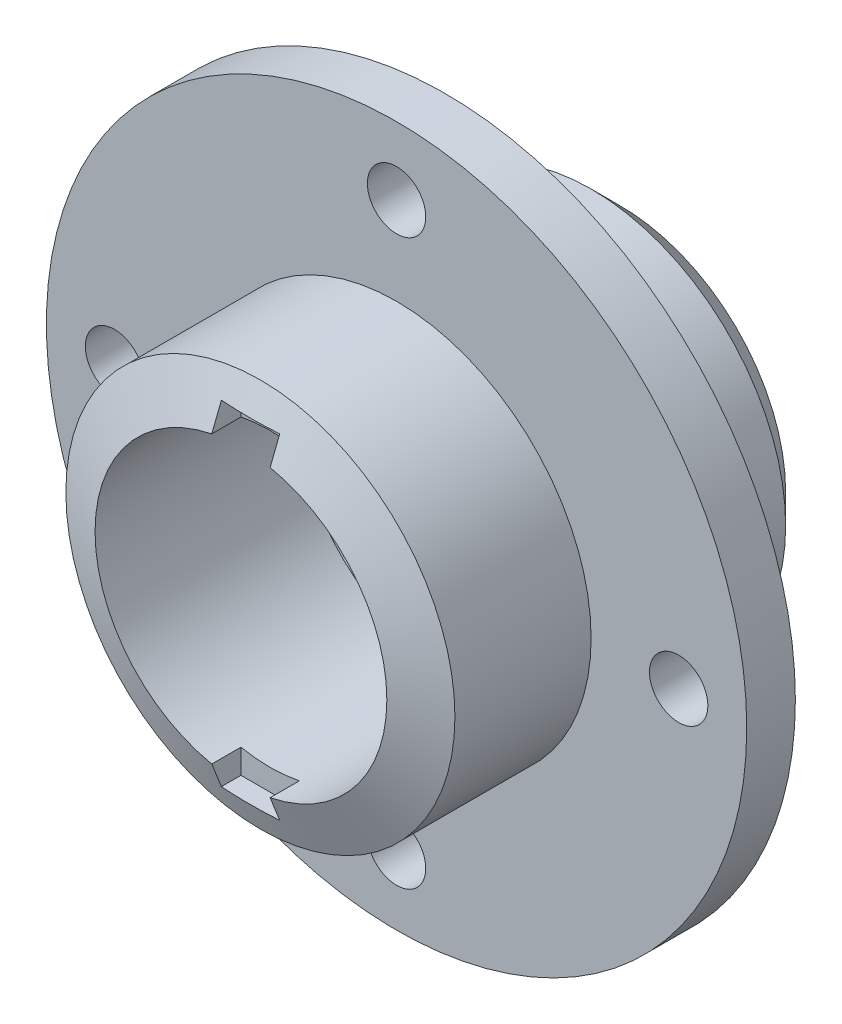
ISO-10303-21;
HEADER;
FILE_DESCRIPTION(('STEP AP214'),'2;1');
FILE_NAME('part.step','',(''),(''),'','','');
FILE_SCHEMA(('AUTOMOTIVE_DESIGN { 1 0 10303 214 1 1 1 1 }'));
ENDSEC;
DATA;
#1=APPLICATION_CONTEXT('core data for automotive mechanical design processes');
#2=APPLICATION_PROTOCOL_DEFINITION('international standard','automotive_design',2000,#1);
#3=PRODUCT_CONTEXT('',#1,'mechanical');
#4=PRODUCT('Part','Part','',(#3));
#5=PRODUCT_RELATED_PRODUCT_CATEGORY('part','',(#4));
#6=PRODUCT_DEFINITION_FORMATION('','',#4);
#7=PRODUCT_DEFINITION_CONTEXT('part definition',#1,'design');
#8=PRODUCT_DEFINITION('design','',#6,#7);
#9=PRODUCT_DEFINITION_SHAPE('','',#8);
#10=(LENGTH_UNIT() NAMED_UNIT(*) SI_UNIT(.MILLI.,.METRE.));
#11=(NAMED_UNIT(*) PLANE_ANGLE_UNIT() SI_UNIT($,.RADIAN.));
#12=(NAMED_UNIT(*) SI_UNIT($,.STERADIAN.) SOLID_ANGLE_UNIT());
#13=UNCERTAINTY_MEASURE_WITH_UNIT(LENGTH_MEASURE(1.E-05),#10,'distance_accuracy_value','');
#14=(GEOMETRIC_REPRESENTATION_CONTEXT(3) GLOBAL_UNCERTAINTY_ASSIGNED_CONTEXT((#13)) GLOBAL_UNIT_ASSIGNED_CONTEXT((#10,
#11,#12)) REPRESENTATION_CONTEXT('',''));
#15=CARTESIAN_POINT('',(0.,0.,0.));
#16=DIRECTION('',(0.,0.,1.));
#17=DIRECTION('',(1.,0.,0.));
#18=AXIS2_PLACEMENT_3D('',#15,#16,#17);
#19=CARTESIAN_POINT('',(34.,0.,-78.));
#20=DIRECTION('',(0.,0.,-1.));
#21=DIRECTION('',(-1.,0.,0.));
#22=AXIS2_PLACEMENT_3D('',#19,#20,#21);
#23=PLANE('',#22);
#24=CARTESIAN_POINT('',(0.,0.,-78.));
#25=DIRECTION('',(0.,0.,1.));
#26=DIRECTION('',(1.,0.,0.));
#27=AXIS2_PLACEMENT_3D('',#24,#25,#26);
#28=CIRCLE('',#27,24.);
#29=CARTESIAN_POINT('',(24.,0.,-78.));
#30=VERTEX_POINT('',#29);
#31=EDGE_CURVE('E206',#30,#30,#28,.T.);
#32=ORIENTED_EDGE('',*,*,#31,.T.);
#33=EDGE_LOOP('',(#32));
#34=FACE_BOUND('',#33,.T.);
#35=CARTESIAN_POINT('',(0.,0.,-78.));
#36=DIRECTION('',(0.,0.,1.));
#37=DIRECTION('',(1.,0.,0.));
#38=AXIS2_PLACEMENT_3D('',#35,#36,#37);
#39=CIRCLE('',#38,34.);
#40=CARTESIAN_POINT('',(34.,0.,-78.));
#41=VERTEX_POINT('',#40);
#42=EDGE_CURVE('E169',#41,#41,#39,.T.);
#43=ORIENTED_EDGE('',*,*,#42,.F.);
#44=EDGE_LOOP('',(#43));
#45=FACE_BOUND('',#44,.T.);
#46=ADVANCED_FACE('F37',(#34,#45),#23,.T.);
#47=CARTESIAN_POINT('',(0.,0.,0.));
#48=DIRECTION('',(0.,0.,1.));
#49=DIRECTION('',(1.,0.,0.));
#50=AXIS2_PLACEMENT_3D('',#47,#48,#49);
#51=CYLINDRICAL_SURFACE('',#50,24.);
#52=CARTESIAN_POINT('',(0.,0.,-72.));
#53=DIRECTION('',(0.,0.,1.));
#54=DIRECTION('',(1.,0.,0.));
#55=AXIS2_PLACEMENT_3D('',#52,#53,#54);
#56=CIRCLE('',#55,24.);
#57=CARTESIAN_POINT('',(24.,0.,-72.));
#58=VERTEX_POINT('',#57);
#59=EDGE_CURVE('E203',#58,#58,#56,.T.);
#60=ORIENTED_EDGE('',*,*,#59,.T.);
#61=EDGE_LOOP('',(#60));
#62=FACE_BOUND('',#61,.T.);
#63=ORIENTED_EDGE('',*,*,#31,.F.);
#64=EDGE_LOOP('',(#63));
#65=FACE_BOUND('',#64,.T.);
#66=ADVANCED_FACE('F277',(#62,#65),#51,.F.);
#67=CARTESIAN_POINT('',(24.,0.,-72.));
#68=DIRECTION('',(0.,0.,1.));
#69=DIRECTION('',(1.,0.,0.));
#70=AXIS2_PLACEMENT_3D('',#67,#68,#69);
#71=PLANE('',#70);
#72=CARTESIAN_POINT('',(0.,0.,-72.));
#73=DIRECTION('',(0.,0.,1.));
#74=DIRECTION('',(1.,0.,0.));
#75=AXIS2_PLACEMENT_3D('',#72,#73,#74);
#76=CIRCLE('',#75,34.);
#77=CARTESIAN_POINT('',(34.,0.,-72.));
#78=VERTEX_POINT('',#77);
#79=EDGE_CURVE('E200',#78,#78,#76,.T.);
#80=ORIENTED_EDGE('',*,*,#79,.T.);
#81=EDGE_LOOP('',(#80));
#82=FACE_BOUND('',#81,.T.);
#83=ORIENTED_EDGE('',*,*,#59,.F.);
#84=EDGE_LOOP('',(#83));
#85=FACE_BOUND('',#84,.T.);
#86=ADVANCED_FACE('F282',(#82,#85),#71,.T.);
#87=CARTESIAN_POINT('',(0.,0.,0.));
#88=DIRECTION('',(0.,0.,1.));
#89=DIRECTION('',(1.,0.,0.));
#90=AXIS2_PLACEMENT_3D('',#87,#88,#89);
#91=CYLINDRICAL_SURFACE('',#90,34.);
#92=CARTESIAN_POINT('',(0.,0.,-42.));
#93=DIRECTION('',(0.,0.,1.));
#94=DIRECTION('',(1.,0.,0.));
#95=AXIS2_PLACEMENT_3D('',#92,#93,#94);
#96=CIRCLE('',#95,34.);
#97=CARTESIAN_POINT('',(34.,0.,-42.));
#98=VERTEX_POINT('',#97);
#99=EDGE_CURVE('E197',#98,#98,#96,.T.);
#100=ORIENTED_EDGE('',*,*,#99,.T.);
#101=EDGE_LOOP('',(#100));
#102=FACE_BOUND('',#101,.T.);
#103=ORIENTED_EDGE('',*,*,#79,.F.);
#104=EDGE_LOOP('',(#103));
#105=FACE_BOUND('',#104,.T.);
#106=ADVANCED_FACE('F498',(#102,#105),#91,.F.);
#107=CARTESIAN_POINT('',(34.,0.,-42.));
#108=DIRECTION('',(0.,0.,-1.));
#109=DIRECTION('',(-1.,0.,0.));
#110=AXIS2_PLACEMENT_3D('',#107,#108,#109);
#111=PLANE('',#110);
#112=CARTESIAN_POINT('',(0.,0.,-42.));
#113=DIRECTION('',(0.,0.,1.));
#114=DIRECTION('',(1.,0.,0.));
#115=AXIS2_PLACEMENT_3D('',#112,#113,#114);
#116=CIRCLE('',#115,30.);
#117=CARTESIAN_POINT('',(30.,0.,-42.));
#118=VERTEX_POINT('',#117);
#119=EDGE_CURVE('E194',#118,#118,#116,.T.);
#120=ORIENTED_EDGE('',*,*,#119,.T.);
#121=EDGE_LOOP('',(#120));
#122=FACE_BOUND('',#121,.T.);
#123=ORIENTED_EDGE('',*,*,#99,.F.);
#124=EDGE_LOOP('',(#123));
#125=FACE_BOUND('',#124,.T.);
#126=ADVANCED_FACE('F333',(#122,#125),#111,.T.);
#127=CARTESIAN_POINT('',(0.,0.,0.));
#128=DIRECTION('',(0.,0.,1.));
#129=DIRECTION('',(1.,0.,0.));
#130=AXIS2_PLACEMENT_3D('',#127,#128,#129);
#131=CYLINDRICAL_SURFACE('',#130,30.);
#132=DIRECTION('',(0.,0.,1.));
#133=VECTOR('',#132,1.);
#134=CARTESIAN_POINT('',(6.,29.3938769133981,0.));
#135=LINE('',#134,#133);
#136=CARTESIAN_POINT('',(6.,29.3938769133981,-6.));
#137=VERTEX_POINT('',#136);
#138=CARTESIAN_POINT('',(6.,29.3938769133981,0.));
#139=VERTEX_POINT('',#138);
#140=EDGE_CURVE('E143',#137,#139,#135,.T.);
#141=ORIENTED_EDGE('',*,*,#140,.F.);
#142=CARTESIAN_POINT('',(0.,0.,-6.));
#143=DIRECTION('',(0.,0.,-1.));
#144=DIRECTION('',(-1.,0.,0.));
#145=AXIS2_PLACEMENT_3D('',#142,#143,#144);
#146=CIRCLE('',#145,30.);
#147=CARTESIAN_POINT('',(-6.,29.3938769133981,-6.));
#148=VERTEX_POINT('',#147);
#149=EDGE_CURVE('E11',#148,#137,#146,.T.);
#150=ORIENTED_EDGE('',*,*,#149,.F.);
#151=DIRECTION('',(0.,0.,1.));
#152=VECTOR('',#151,1.);
#153=CARTESIAN_POINT('',(-6.,29.3938769133981,0.));
#154=LINE('',#153,#152);
#155=CARTESIAN_POINT('',(-6.,29.3938769133981,0.));
#156=VERTEX_POINT('',#155);
#157=EDGE_CURVE('E141',#156,#148,#154,.F.);
#158=ORIENTED_EDGE('',*,*,#157,.F.);
#159=CARTESIAN_POINT('',(0.,0.,0.));
#160=DIRECTION('',(0.,0.,1.));
#161=DIRECTION('',(1.,0.,0.));
#162=AXIS2_PLACEMENT_3D('',#159,#160,#161);
#163=CIRCLE('',#162,30.);
#164=CARTESIAN_POINT('',(-6.,-29.3938769133981,0.));
#165=VERTEX_POINT('',#164);
#166=EDGE_CURVE('E193',#156,#165,#163,.T.);
#167=ORIENTED_EDGE('',*,*,#166,.T.);
#168=DIRECTION('',(0.,0.,1.));
#169=VECTOR('',#168,1.);
#170=CARTESIAN_POINT('',(-6.,-29.3938769133981,0.));
#171=LINE('',#170,#169);
#172=CARTESIAN_POINT('',(-6.,-29.3938769133981,-6.));
#173=VERTEX_POINT('',#172);
#174=EDGE_CURVE('E59',#173,#165,#171,.T.);
#175=ORIENTED_EDGE('',*,*,#174,.F.);
#176=CARTESIAN_POINT('',(0.,0.,-6.));
#177=DIRECTION('',(0.,0.,-1.));
#178=DIRECTION('',(-1.,0.,0.));
#179=AXIS2_PLACEMENT_3D('',#176,#177,#178);
#180=CIRCLE('',#179,30.);
#181=CARTESIAN_POINT('',(6.,-29.3938769133981,-6.));
#182=VERTEX_POINT('',#181);
#183=EDGE_CURVE('E44',#182,#173,#180,.T.);
#184=ORIENTED_EDGE('',*,*,#183,.F.);
#185=DIRECTION('',(0.,0.,1.));
#186=VECTOR('',#185,1.);
#187=CARTESIAN_POINT('',(6.,-29.3938769133981,0.));
#188=LINE('',#187,#186);
#189=CARTESIAN_POINT('',(6.,-29.3938769133981,0.));
#190=VERTEX_POINT('',#189);
#191=EDGE_CURVE('E139',#190,#182,#188,.F.);
#192=ORIENTED_EDGE('',*,*,#191,.F.);
#193=EDGE_CURVE('E190',#190,#139,#163,.T.);
#194=ORIENTED_EDGE('',*,*,#193,.T.);
#195=EDGE_LOOP('',(#141,#150,#158,#167,#175,#184,#192,#194));
#196=FACE_BOUND('',#195,.T.);
#197=ORIENTED_EDGE('',*,*,#119,.F.);
#198=EDGE_LOOP('',(#197));
#199=FACE_BOUND('',#198,.T.);
#200=ADVANCED_FACE('F327',(#196,#199),#131,.F.);
#201=CARTESIAN_POINT('',(0.,0.,0.));
#202=DIRECTION('',(0.,0.,-1.));
#203=DIRECTION('',(-1.,0.,0.));
#204=AXIS2_PLACEMENT_3D('',#201,#202,#203);
#205=CONICAL_SURFACE('',#204,30.,1.19028994968253);
#206=CARTESIAN_POINT('',(6.,15.9032186925145,5.20103108073653));
#207=CARTESIAN_POINT('',(6.,16.2471977664152,5.0722921317779));
#208=CARTESIAN_POINT('',(6.,16.5910089156587,4.94310558325806));
#209=CARTESIAN_POINT('',(6.,17.2783394675195,4.68396007527186));
#210=CARTESIAN_POINT('',(6.,17.6218588705637,4.55400111693794));
#211=CARTESIAN_POINT('',(6.,18.6520433109009,4.16315068803234));
#212=CARTESIAN_POINT('',(6.,19.3383383999416,3.90128423057027));
#213=CARTESIAN_POINT('',(6.,20.7101830837089,3.37563436498289));
#214=CARTESIAN_POINT('',(6.,21.395732687909,3.11185098155264));
#215=CARTESIAN_POINT('',(6.,22.7662668630738,2.58281775417957));
#216=CARTESIAN_POINT('',(6.,23.4512514331158,2.3175679078472));
#217=CARTESIAN_POINT('',(6.,25.5055235666202,1.52013991498337));
#218=CARTESIAN_POINT('',(6.,26.8741555206906,0.98627333273486));
#219=CARTESIAN_POINT('',(6.,29.610309512199,-0.0843071539926957));
#220=CARTESIAN_POINT('',(6.,30.9778315456326,-0.621021068692702));
#221=CARTESIAN_POINT('',(6.,33.3248717668304,-1.54409309170136));
#222=CARTESIAN_POINT('',(6.,34.3045757583233,-1.92997893147859));
#223=CARTESIAN_POINT('',(6.,36.2636752222133,-2.70252859811606));
#224=CARTESIAN_POINT('',(6.,37.2430706950668,-3.08919242381898));
#225=CARTESIAN_POINT('',(6.,39.2016297255195,-3.8631379492448));
#226=CARTESIAN_POINT('',(6.,40.1807932804864,-4.250419655628));
#227=CARTESIAN_POINT('',(6.,42.1389238584771,-5.02548352932511));
#228=CARTESIAN_POINT('',(6.,43.1178908812304,-5.4132656973226));
#229=CARTESIAN_POINT('',(6.,44.0967813074855,-5.80124095305809));
#230=B_SPLINE_CURVE_WITH_KNOTS('',3,(#206,#207,#208,#209,#210,#211,#212,#213,#214,#215,#216,
#217,#218,#219,#220,#221,#222,#223,#224,#225,#226,#227,#228,#229),.UNSPECIFIED.,.F.,.F.,(4,2,2,
2,2,2,2,2,2,2,2,4),(0.,1.10184206428757,2.20368251354551,4.40735117082963,6.61099148919058,
8.81463539934729,13.2218397611267,17.6290599539973,20.7879438761772,23.946823102742,
27.105736612934,30.2646544424389),.UNSPECIFIED.);
#231=CARTESIAN_POINT('',(6.,34.4106853403474,-1.97194483580522));
#232=VERTEX_POINT('',#231);
#233=EDGE_CURVE('E113',#139,#232,#230,.T.);
#234=ORIENTED_EDGE('',*,*,#233,.F.);
#235=ORIENTED_EDGE('',*,*,#193,.F.);
#236=CARTESIAN_POINT('',(6.,-44.0967813074855,-5.8012409530581));
#237=CARTESIAN_POINT('',(6.,-42.9244760605672,-5.33661350729933));
#238=CARTESIAN_POINT('',(6.,-41.7520639729235,-4.87225522328885));
#239=CARTESIAN_POINT('',(6.,-39.4069430761195,-3.9442879832984));
#240=CARTESIAN_POINT('',(6.,-38.2342342669073,-3.48067902744966));
#241=CARTESIAN_POINT('',(6.,-35.8884558102124,-2.55442892112128));
#242=CARTESIAN_POINT('',(6.,-34.7153861687173,-2.09178775548147));
#243=CARTESIAN_POINT('',(6.,-32.3687377678283,-1.1677931197507));
#244=CARTESIAN_POINT('',(6.,-31.1951590077261,-0.706439651457936));
#245=CARTESIAN_POINT('',(6.,-28.8472816422155,0.214499167453027));
#246=CARTESIAN_POINT('',(6.,-27.6729830233735,0.674084483833399));
#247=CARTESIAN_POINT('',(6.,-25.323400587753,1.59072128797729));
#248=CARTESIAN_POINT('',(6.,-24.1481167743113,2.04777278428275));
#249=CARTESIAN_POINT('',(6.,-22.3840687499121,2.73048255380394));
#250=CARTESIAN_POINT('',(6.,-21.7958603319976,2.95757661848426));
#251=CARTESIAN_POINT('',(6.,-20.6189767929767,3.41055038588427));
#252=CARTESIAN_POINT('',(6.,-20.0303016724586,3.63643009013175));
#253=CARTESIAN_POINT('',(6.,-18.8523584551429,4.08665984182876));
#254=CARTESIAN_POINT('',(6.,-18.2630903517178,4.311009871959));
#255=CARTESIAN_POINT('',(6.,-17.0837804032856,4.75767392522621));
#256=CARTESIAN_POINT('',(6.,-16.4937385549225,4.97998793949874));
#257=CARTESIAN_POINT('',(6.,-15.9032186925145,5.20103108073654));
#258=B_SPLINE_CURVE_WITH_KNOTS('',3,(#236,#237,#238,#239,#240,#241,#242,#243,#244,#245,#246,
#247,#248,#249,#250,#251,#252,#253,#254,#255,#256,#257),.UNSPECIFIED.,.F.,.F.,(4,2,2,2,2,2,2,2,
2,2,4),(0.,3.78306830186727,7.56613726615146,11.3491465191262,15.1321610521589,18.915248473037,
22.6983231327154,24.5898948976484,26.4814642822344,28.3730550481165,30.2646540457269),.UNSPECIFIED.);
#259=CARTESIAN_POINT('',(6.,-34.4106853403474,-1.97194483580522));
#260=VERTEX_POINT('',#259);
#261=EDGE_CURVE('E247',#260,#190,#258,.T.);
#262=ORIENTED_EDGE('',*,*,#261,.F.);
#263=CARTESIAN_POINT('',(-18.6493106406735,-34.4106853403474,-3.65575703932448));
#264=CARTESIAN_POINT('',(-17.9637223466805,-34.4106853403474,-3.52509404029263));
#265=CARTESIAN_POINT('',(-17.2771241409235,-34.4106853403474,-3.39979788629505));
#266=CARTESIAN_POINT('',(-15.9018519025437,-34.4106853403474,-3.16089716758181));
#267=CARTESIAN_POINT('',(-15.2131777335133,-34.4106853403474,-3.04729338918154));
#268=CARTESIAN_POINT('',(-13.1434675432687,-34.4106853403474,-2.72538532067426));
#269=CARTESIAN_POINT('',(-11.7593682842637,-34.4106853403474,-2.53610507667044));
#270=CARTESIAN_POINT('',(-9.67864026799761,-34.4106853403474,-2.29590185365802));
#271=CARTESIAN_POINT('',(-8.98447697251851,-34.4106853403474,-2.2231331667537));
#272=CARTESIAN_POINT('',(-7.59471936871186,-34.4106853403474,-2.09294230616486));
#273=CARTESIAN_POINT('',(-6.89912510946645,-34.4106853403474,-2.03551961467263));
#274=CARTESIAN_POINT('',(-5.50691984054422,-34.4106853403474,-1.9367266695143));
#275=CARTESIAN_POINT('',(-4.81030903250701,-34.4106853403474,-1.89535357785703));
#276=CARTESIAN_POINT('',(-3.41629877163914,-34.4106853403474,-1.82917170452082));
#277=CARTESIAN_POINT('',(-2.7188993211948,-34.4106853403474,-1.80436287285452));
#278=CARTESIAN_POINT('',(-1.33453108925692,-34.4106853403474,-1.77189138701338));
#279=CARTESIAN_POINT('',(-0.647568418531589,-34.4106853403474,-1.76396858255442));
#280=CARTESIAN_POINT('',(0.726349571525627,-34.4106853403474,-1.76459772617926));
#281=CARTESIAN_POINT('',(1.41330489085742,-34.4106853403474,-1.77314967447476));
#282=CARTESIAN_POINT('',(2.78687592895106,-34.4106853403474,-1.80661850811205));
#283=CARTESIAN_POINT('',(3.47349161240106,-34.4106853403474,-1.8315368373109));
#284=CARTESIAN_POINT('',(4.84594791949403,-34.4106853403474,-1.89742026242737));
#285=CARTESIAN_POINT('',(5.53178854394659,-34.4106853403474,-1.93838534156786));
#286=CARTESIAN_POINT('',(6.90197098633294,-34.4106853403474,-2.03582975236739));
#287=CARTESIAN_POINT('',(7.5863134379155,-34.4106853403474,-2.0923001806041));
#288=CARTESIAN_POINT('',(8.95361502178836,-34.4106853403474,-2.22010076543245));
#289=CARTESIAN_POINT('',(9.63657410521466,-34.4106853403474,-2.29143143799153));
#290=CARTESIAN_POINT('',(11.6828408735914,-34.4106853403474,-2.5265433363252));
#291=CARTESIAN_POINT('',(13.043786216387,-34.4106853403474,-2.71146261360048));
#292=CARTESIAN_POINT('',(14.7555108840365,-34.4106853403474,-2.97578331285228));
#293=CARTESIAN_POINT('',(15.1099980614607,-34.4106853403474,-3.03224719881094));
#294=CARTESIAN_POINT('',(15.8184031289724,-34.4106853403474,-3.14840107133548));
#295=CARTESIAN_POINT('',(16.1723210858279,-34.4106853403474,-3.20809064601766));
#296=CARTESIAN_POINT('',(16.8803825440481,-34.4106853403474,-3.33070377428368));
#297=CARTESIAN_POINT('',(17.2345248781715,-34.4106853403474,-3.39363404202517));
#298=CARTESIAN_POINT('',(17.9423058593307,-34.4106853403474,-3.52248598128532));
#299=CARTESIAN_POINT('',(18.2959444458794,-34.4106853403474,-3.58840798517079));
#300=CARTESIAN_POINT('',(18.6493106406735,-34.4106853403474,-3.65575703932448));
#301=B_SPLINE_CURVE_WITH_KNOTS('',3,(#263,#264,#265,#266,#267,#268,#269,#270,#271,#272,#273,
#274,#275,#276,#277,#278,#279,#280,#281,#282,#283,#284,#285,#286,#287,#288,#289,#290,#291,#292,
#293,#294,#295,#296,#297,#298,#299,#300),.UNSPECIFIED.,.F.,.F.,(4,2,2,2,2,2,2,2,2,2,2,2,2,2,2,2,
2,2,4),(0.,2.09372952453769,4.18759976107154,8.37724729568618,10.4710137123379,12.5647094717728,
14.6580348418178,16.7513538946299,18.8121824214243,20.8730109747001,22.9340213605781,
24.9950295916455,27.0548568245186,29.1147555892566,33.2338072758304,34.3106743706585,
35.3874042852335,36.466462559853,37.5456410072731),.UNSPECIFIED.);
#302=CARTESIAN_POINT('',(-6.,-34.4106853403474,-1.97194483580522));
#303=VERTEX_POINT('',#302);
#304=EDGE_CURVE('E217',#303,#260,#301,.T.);
#305=ORIENTED_EDGE('',*,*,#304,.F.);
#306=CARTESIAN_POINT('',(-6.,-15.9032186925145,5.20103108073653));
#307=CARTESIAN_POINT('',(-6.,-16.2471977664152,5.0722921317779));
#308=CARTESIAN_POINT('',(-6.,-16.5910089156587,4.94310558325806));
#309=CARTESIAN_POINT('',(-6.,-17.2783394675195,4.68396007527186));
#310=CARTESIAN_POINT('',(-6.,-17.6218588705637,4.55400111693793));
#311=CARTESIAN_POINT('',(-6.,-18.6520433109009,4.16315068803234));
#312=CARTESIAN_POINT('',(-6.,-19.3383383999416,3.90128423057027));
#313=CARTESIAN_POINT('',(-6.,-20.7101830837089,3.37563436498289));
#314=CARTESIAN_POINT('',(-6.,-21.395732687909,3.11185098155264));
#315=CARTESIAN_POINT('',(-6.,-22.7662668630738,2.58281775417956));
#316=CARTESIAN_POINT('',(-6.,-23.4512514331158,2.3175679078472));
#317=CARTESIAN_POINT('',(-6.,-25.5055235666202,1.52013991498337));
#318=CARTESIAN_POINT('',(-6.,-26.8741555206906,0.98627333273486));
#319=CARTESIAN_POINT('',(-6.,-29.610309512199,-0.0843071539926958));
#320=CARTESIAN_POINT('',(-6.,-30.9778315456326,-0.621021068692702));
#321=CARTESIAN_POINT('',(-6.,-33.3248717668304,-1.54409309170136));
#322=CARTESIAN_POINT('',(-6.,-34.3045757583233,-1.92997893147859));
#323=CARTESIAN_POINT('',(-6.,-36.2636752222133,-2.70252859811606));
#324=CARTESIAN_POINT('',(-6.,-37.2430706950668,-3.08919242381898));
#325=CARTESIAN_POINT('',(-6.,-39.2016297255195,-3.8631379492448));
#326=CARTESIAN_POINT('',(-6.,-40.1807932804864,-4.250419655628));
#327=CARTESIAN_POINT('',(-6.,-42.1389238584771,-5.02548352932511));
#328=CARTESIAN_POINT('',(-6.,-43.1178908812304,-5.4132656973226));
#329=CARTESIAN_POINT('',(-6.,-44.0967813074855,-5.8012409530581));
#330=B_SPLINE_CURVE_WITH_KNOTS('',3,(#306,#307,#308,#309,#310,#311,#312,#313,#314,#315,#316,
#317,#318,#319,#320,#321,#322,#323,#324,#325,#326,#327,#328,#329),.UNSPECIFIED.,.F.,.F.,(4,2,2,
2,2,2,2,2,2,2,2,4),(0.,1.10184206428757,2.20368251354551,4.40735117082963,6.61099148919058,
8.81463539934729,13.2218397611267,17.6290599539973,20.7879438761772,23.946823102742,
27.105736612934,30.2646544424388),.UNSPECIFIED.);
#331=EDGE_CURVE('E209',#165,#303,#330,.T.);
#332=ORIENTED_EDGE('',*,*,#331,.F.);
#333=ORIENTED_EDGE('',*,*,#166,.F.);
#334=CARTESIAN_POINT('',(-6.,44.0967813074855,-5.8012409530581));
#335=CARTESIAN_POINT('',(-6.,42.9244760605672,-5.33661350729933));
#336=CARTESIAN_POINT('',(-6.,41.7520639729235,-4.87225522328885));
#337=CARTESIAN_POINT('',(-6.,39.4069430761195,-3.9442879832984));
#338=CARTESIAN_POINT('',(-6.,38.2342342669073,-3.48067902744966));
#339=CARTESIAN_POINT('',(-6.,35.8884558102124,-2.55442892112128));
#340=CARTESIAN_POINT('',(-6.,34.7153861687173,-2.09178775548147));
#341=CARTESIAN_POINT('',(-6.,32.3687377678283,-1.1677931197507));
#342=CARTESIAN_POINT('',(-6.,31.1951590077261,-0.706439651457936));
#343=CARTESIAN_POINT('',(-6.,28.8472816422155,0.214499167453027));
#344=CARTESIAN_POINT('',(-6.,27.6729830233735,0.674084483833399));
#345=CARTESIAN_POINT('',(-6.,25.323400587753,1.59072128797729));
#346=CARTESIAN_POINT('',(-6.,24.1481167743113,2.04777278428274));
#347=CARTESIAN_POINT('',(-6.,22.3840687499121,2.73048255380394));
#348=CARTESIAN_POINT('',(-6.,21.7958603319976,2.95757661848426));
#349=CARTESIAN_POINT('',(-6.,20.6189767929767,3.41055038588427));
#350=CARTESIAN_POINT('',(-6.,20.0303016724586,3.63643009013175));
#351=CARTESIAN_POINT('',(-6.,18.8523584551429,4.08665984182876));
#352=CARTESIAN_POINT('',(-6.,18.2630903517178,4.311009871959));
#353=CARTESIAN_POINT('',(-6.,17.0837804032856,4.75767392522621));
#354=CARTESIAN_POINT('',(-6.,16.4937385549225,4.97998793949874));
#355=CARTESIAN_POINT('',(-6.,15.9032186925145,5.20103108073653));
#356=B_SPLINE_CURVE_WITH_KNOTS('',3,(#334,#335,#336,#337,#338,#339,#340,#341,#342,#343,#344,
#345,#346,#347,#348,#349,#350,#351,#352,#353,#354,#355),.UNSPECIFIED.,.F.,.F.,(4,2,2,2,2,2,2,2,
2,2,4),(0.,3.78306830186727,7.56613726615146,11.3491465191262,15.1321610521589,18.915248473037,
22.6983231327154,24.5898948976484,26.4814642822344,28.3730550481165,30.2646540457269),.UNSPECIFIED.);
#357=CARTESIAN_POINT('',(-6.,34.4106853403474,-1.97194483580522));
#358=VERTEX_POINT('',#357);
#359=EDGE_CURVE('E259',#358,#156,#356,.T.);
#360=ORIENTED_EDGE('',*,*,#359,.F.);
#361=CARTESIAN_POINT('',(18.6493106406735,34.4106853403474,-3.65575703932448));
#362=CARTESIAN_POINT('',(17.9637223466805,34.4106853403474,-3.52509404029263));
#363=CARTESIAN_POINT('',(17.2771241409235,34.4106853403474,-3.39979788629506));
#364=CARTESIAN_POINT('',(15.9018519025437,34.4106853403474,-3.16089716758181));
#365=CARTESIAN_POINT('',(15.2131777335133,34.4106853403474,-3.04729338918153));
#366=CARTESIAN_POINT('',(13.1434675432687,34.4106853403474,-2.72538532067426));
#367=CARTESIAN_POINT('',(11.7593682842637,34.4106853403474,-2.53610507667043));
#368=CARTESIAN_POINT('',(9.6786402679976,34.4106853403474,-2.29590185365802));
#369=CARTESIAN_POINT('',(8.98447697251851,34.4106853403474,-2.2231331667537));
#370=CARTESIAN_POINT('',(7.59471936871185,34.4106853403474,-2.09294230616486));
#371=CARTESIAN_POINT('',(6.89912510946645,34.4106853403474,-2.03551961467264));
#372=CARTESIAN_POINT('',(5.50691984054422,34.4106853403474,-1.9367266695143));
#373=CARTESIAN_POINT('',(4.81030903250701,34.4106853403474,-1.89535357785702));
#374=CARTESIAN_POINT('',(3.41629877163914,34.4106853403474,-1.82917170452082));
#375=CARTESIAN_POINT('',(2.7188993211948,34.4106853403474,-1.80436287285452));
#376=CARTESIAN_POINT('',(1.33453108925692,34.4106853403474,-1.77189138701338));
#377=CARTESIAN_POINT('',(0.647568418531585,34.4106853403474,-1.76396858255442));
#378=CARTESIAN_POINT('',(-0.726349571525631,34.4106853403474,-1.76459772617926));
#379=CARTESIAN_POINT('',(-1.41330489085742,34.4106853403474,-1.77314967447476));
#380=CARTESIAN_POINT('',(-2.78687592895107,34.4106853403474,-1.80661850811205));
#381=CARTESIAN_POINT('',(-3.47349161240106,34.4106853403474,-1.8315368373109));
#382=CARTESIAN_POINT('',(-4.84594791949404,34.4106853403474,-1.89742026242737));
#383=CARTESIAN_POINT('',(-5.53178854394659,34.4106853403474,-1.93838534156786));
#384=CARTESIAN_POINT('',(-6.90197098633294,34.4106853403474,-2.0358297523674));
#385=CARTESIAN_POINT('',(-7.5863134379155,34.4106853403474,-2.0923001806041));
#386=CARTESIAN_POINT('',(-8.95361502178836,34.4106853403474,-2.22010076543245));
#387=CARTESIAN_POINT('',(-9.63657410521466,34.4106853403474,-2.29143143799153));
#388=CARTESIAN_POINT('',(-11.6828408735914,34.4106853403474,-2.5265433363252));
#389=CARTESIAN_POINT('',(-13.043786216387,34.4106853403474,-2.71146261360048));
#390=CARTESIAN_POINT('',(-14.7555108840365,34.4106853403474,-2.97578331285228));
#391=CARTESIAN_POINT('',(-15.1099980614607,34.4106853403474,-3.03224719881094));
#392=CARTESIAN_POINT('',(-15.8184031289724,34.4106853403474,-3.14840107133549));
#393=CARTESIAN_POINT('',(-16.1723210858279,34.4106853403474,-3.20809064601767));
#394=CARTESIAN_POINT('',(-16.8803825440481,34.4106853403474,-3.33070377428369));
#395=CARTESIAN_POINT('',(-17.2345248781715,34.4106853403474,-3.39363404202517));
#396=CARTESIAN_POINT('',(-17.9423058593307,34.4106853403474,-3.52248598128532));
#397=CARTESIAN_POINT('',(-18.2959444458794,34.4106853403474,-3.58840798517079));
#398=CARTESIAN_POINT('',(-18.6493106406735,34.4106853403474,-3.65575703932448));
#399=B_SPLINE_CURVE_WITH_KNOTS('',3,(#361,#362,#363,#364,#365,#366,#367,#368,#369,#370,#371,
#372,#373,#374,#375,#376,#377,#378,#379,#380,#381,#382,#383,#384,#385,#386,#387,#388,#389,#390,
#391,#392,#393,#394,#395,#396,#397,#398),.UNSPECIFIED.,.F.,.F.,(4,2,2,2,2,2,2,2,2,2,2,2,2,2,2,2,
2,2,4),(0.,2.09372952453769,4.18759976107154,8.37724729568618,10.4710137123379,12.5647094717728,
14.6580348418179,16.7513538946299,18.8121824214244,20.8730109747001,22.9340213605781,
24.9950295916455,27.0548568245186,29.1147555892566,33.2338072758304,34.3106743706585,
35.3874042852335,36.466462559853,37.5456410072731),.UNSPECIFIED.);
#400=EDGE_CURVE('E253',#232,#358,#399,.T.);
#401=ORIENTED_EDGE('',*,*,#400,.F.);
#402=EDGE_LOOP('',(#234,#235,#262,#305,#332,#333,#360,#401));
#403=FACE_BOUND('',#402,.T.);
#404=CARTESIAN_POINT('',(0.,0.,-4.));
#405=DIRECTION('',(0.,0.,1.));
#406=DIRECTION('',(1.,0.,0.));
#407=AXIS2_PLACEMENT_3D('',#404,#405,#406);
#408=CIRCLE('',#407,40.);
#409=CARTESIAN_POINT('',(40.,0.,-4.));
#410=VERTEX_POINT('',#409);
#411=EDGE_CURVE('E187',#410,#410,#408,.T.);
#412=ORIENTED_EDGE('',*,*,#411,.T.);
#413=EDGE_LOOP('',(#412));
#414=FACE_BOUND('',#413,.T.);
#415=ADVANCED_FACE('F224',(#403,#414),#205,.T.);
#416=CARTESIAN_POINT('',(0.,0.,0.));
#417=DIRECTION('',(0.,0.,1.));
#418=DIRECTION('',(1.,0.,0.));
#419=AXIS2_PLACEMENT_3D('',#416,#417,#418);
#420=CYLINDRICAL_SURFACE('',#419,40.);
#421=CARTESIAN_POINT('',(0.,0.,-32.));
#422=DIRECTION('',(0.,0.,1.));
#423=DIRECTION('',(1.,0.,0.));
#424=AXIS2_PLACEMENT_3D('',#421,#422,#423);
#425=CIRCLE('',#424,40.);
#426=CARTESIAN_POINT('',(40.,0.,-32.));
#427=VERTEX_POINT('',#426);
#428=EDGE_CURVE('E184',#427,#427,#425,.T.);
#429=ORIENTED_EDGE('',*,*,#428,.T.);
#430=EDGE_LOOP('',(#429));
#431=FACE_BOUND('',#430,.T.);
#432=ORIENTED_EDGE('',*,*,#411,.F.);
#433=EDGE_LOOP('',(#432));
#434=FACE_BOUND('',#433,.T.);
#435=ADVANCED_FACE('F317',(#431,#434),#420,.T.);
#436=CARTESIAN_POINT('',(40.,0.,-32.));
#437=DIRECTION('',(0.,0.,1.));
#438=DIRECTION('',(1.,0.,0.));
#439=AXIS2_PLACEMENT_3D('',#436,#437,#438);
#440=PLANE('',#439);
#441=CARTESIAN_POINT('',(0.,58.,-32.));
#442=DIRECTION('',(0.,0.,1.));
#443=DIRECTION('',(1.,0.,0.));
#444=AXIS2_PLACEMENT_3D('',#441,#442,#443);
#445=CIRCLE('',#444,6.);
#446=CARTESIAN_POINT('',(6.,58.,-32.));
#447=VERTEX_POINT('',#446);
#448=EDGE_CURVE('E166',#447,#447,#445,.T.);
#449=ORIENTED_EDGE('',*,*,#448,.F.);
#450=EDGE_LOOP('',(#449));
#451=FACE_BOUND('',#450,.T.);
#452=CARTESIAN_POINT('',(-58.,0.,-32.));
#453=DIRECTION('',(0.,0.,1.));
#454=DIRECTION('',(1.,0.,0.));
#455=AXIS2_PLACEMENT_3D('',#452,#453,#454);
#456=CIRCLE('',#455,6.0000000000002);
#457=CARTESIAN_POINT('',(-51.9999999999998,0.,-32.));
#458=VERTEX_POINT('',#457);
#459=EDGE_CURVE('E163',#458,#458,#456,.T.);
#460=ORIENTED_EDGE('',*,*,#459,.F.);
#461=EDGE_LOOP('',(#460));
#462=FACE_BOUND('',#461,.T.);
#463=CARTESIAN_POINT('',(0.,-58.,-32.));
#464=DIRECTION('',(0.,0.,1.));
#465=DIRECTION('',(1.,0.,0.));
#466=AXIS2_PLACEMENT_3D('',#463,#464,#465);
#467=CIRCLE('',#466,6.00000000000039);
#468=CARTESIAN_POINT('',(6.00000000000039,-58.,-32.));
#469=VERTEX_POINT('',#468);
#470=EDGE_CURVE('E160',#469,#469,#467,.T.);
#471=ORIENTED_EDGE('',*,*,#470,.F.);
#472=EDGE_LOOP('',(#471));
#473=FACE_BOUND('',#472,.T.);
#474=CARTESIAN_POINT('',(58.,0.,-32.));
#475=DIRECTION('',(0.,0.,1.));
#476=DIRECTION('',(1.,0.,0.));
#477=AXIS2_PLACEMENT_3D('',#474,#475,#476);
#478=CIRCLE('',#477,6.00000000000059);
#479=CARTESIAN_POINT('',(64.0000000000006,0.,-32.));
#480=VERTEX_POINT('',#479);
#481=EDGE_CURVE('E149',#480,#480,#478,.T.);
#482=ORIENTED_EDGE('',*,*,#481,.F.);
#483=EDGE_LOOP('',(#482));
#484=FACE_BOUND('',#483,.T.);
#485=CARTESIAN_POINT('',(0.,0.,-32.));
#486=DIRECTION('',(0.,0.,1.));
#487=DIRECTION('',(1.,0.,0.));
#488=AXIS2_PLACEMENT_3D('',#485,#486,#487);
#489=CIRCLE('',#488,72.);
#490=CARTESIAN_POINT('',(72.,0.,-32.));
#491=VERTEX_POINT('',#490);
#492=EDGE_CURVE('E181',#491,#491,#489,.T.);
#493=ORIENTED_EDGE('',*,*,#492,.T.);
#494=EDGE_LOOP('',(#493));
#495=FACE_BOUND('',#494,.T.);
#496=ORIENTED_EDGE('',*,*,#428,.F.);
#497=EDGE_LOOP('',(#496));
#498=FACE_BOUND('',#497,.T.);
#499=ADVANCED_FACE('F311',(#451,#462,#473,#484,#495,#498),#440,.T.);
#500=CARTESIAN_POINT('',(0.,0.,0.));
#501=DIRECTION('',(0.,0.,1.));
#502=DIRECTION('',(1.,0.,0.));
#503=AXIS2_PLACEMENT_3D('',#500,#501,#502);
#504=CYLINDRICAL_SURFACE('',#503,72.);
#505=CARTESIAN_POINT('',(0.,0.,-42.));
#506=DIRECTION('',(0.,0.,1.));
#507=DIRECTION('',(1.,0.,0.));
#508=AXIS2_PLACEMENT_3D('',#505,#506,#507);
#509=CIRCLE('',#508,72.);
#510=CARTESIAN_POINT('',(72.,0.,-42.));
#511=VERTEX_POINT('',#510);
#512=EDGE_CURVE('E178',#511,#511,#509,.T.);
#513=ORIENTED_EDGE('',*,*,#512,.T.);
#514=EDGE_LOOP('',(#513));
#515=FACE_BOUND('',#514,.T.);
#516=ORIENTED_EDGE('',*,*,#492,.F.);
#517=EDGE_LOOP('',(#516));
#518=FACE_BOUND('',#517,.T.);
#519=ADVANCED_FACE('F304',(#515,#518),#504,.T.);
#520=CARTESIAN_POINT('',(72.,0.,-42.));
#521=DIRECTION('',(0.,0.,-1.));
#522=DIRECTION('',(-1.,0.,0.));
#523=AXIS2_PLACEMENT_3D('',#520,#521,#522);
#524=PLANE('',#523);
#525=CARTESIAN_POINT('',(0.,58.,-42.));
#526=DIRECTION('',(0.,0.,-1.));
#527=DIRECTION('',(-1.,0.,0.));
#528=AXIS2_PLACEMENT_3D('',#525,#526,#527);
#529=CIRCLE('',#528,6.);
#530=CARTESIAN_POINT('',(-6.,58.,-42.));
#531=VERTEX_POINT('',#530);
#532=EDGE_CURVE('E146',#531,#531,#529,.T.);
#533=ORIENTED_EDGE('',*,*,#532,.F.);
#534=EDGE_LOOP('',(#533));
#535=FACE_BOUND('',#534,.T.);
#536=CARTESIAN_POINT('',(-58.,0.,-42.));
#537=DIRECTION('',(0.,0.,-1.));
#538=DIRECTION('',(-1.,0.,0.));
#539=AXIS2_PLACEMENT_3D('',#536,#537,#538);
#540=CIRCLE('',#539,6.0000000000002);
#541=CARTESIAN_POINT('',(-64.0000000000002,0.,-42.));
#542=VERTEX_POINT('',#541);
#543=EDGE_CURVE('E150',#542,#542,#540,.T.);
#544=ORIENTED_EDGE('',*,*,#543,.F.);
#545=EDGE_LOOP('',(#544));
#546=FACE_BOUND('',#545,.T.);
#547=CARTESIAN_POINT('',(0.,-58.,-42.));
#548=DIRECTION('',(0.,0.,-1.));
#549=DIRECTION('',(-1.,0.,0.));
#550=AXIS2_PLACEMENT_3D('',#547,#548,#549);
#551=CIRCLE('',#550,6.00000000000039);
#552=CARTESIAN_POINT('',(-6.0000000000004,-58.,-42.));
#553=VERTEX_POINT('',#552);
#554=EDGE_CURVE('E153',#553,#553,#551,.T.);
#555=ORIENTED_EDGE('',*,*,#554,.F.);
#556=EDGE_LOOP('',(#555));
#557=FACE_BOUND('',#556,.T.);
#558=CARTESIAN_POINT('',(58.,0.,-42.));
#559=DIRECTION('',(0.,0.,-1.));
#560=DIRECTION('',(-1.,0.,0.));
#561=AXIS2_PLACEMENT_3D('',#558,#559,#560);
#562=CIRCLE('',#561,6.00000000000059);
#563=CARTESIAN_POINT('',(51.9999999999994,0.,-42.));
#564=VERTEX_POINT('',#563);
#565=EDGE_CURVE('E145',#564,#564,#562,.T.);
#566=ORIENTED_EDGE('',*,*,#565,.F.);
#567=EDGE_LOOP('',(#566));
#568=FACE_BOUND('',#567,.T.);
#569=CARTESIAN_POINT('',(0.,0.,-42.));
#570=DIRECTION('',(0.,0.,1.));
#571=DIRECTION('',(1.,0.,0.));
#572=AXIS2_PLACEMENT_3D('',#569,#570,#571);
#573=CIRCLE('',#572,40.);
#574=CARTESIAN_POINT('',(40.,0.,-42.));
#575=VERTEX_POINT('',#574);
#576=EDGE_CURVE('E175',#575,#575,#573,.T.);
#577=ORIENTED_EDGE('',*,*,#576,.T.);
#578=EDGE_LOOP('',(#577));
#579=FACE_BOUND('',#578,.T.);
#580=ORIENTED_EDGE('',*,*,#512,.F.);
#581=EDGE_LOOP('',(#580));
#582=FACE_BOUND('',#581,.T.);
#583=ADVANCED_FACE('F298',(#535,#546,#557,#568,#579,#582),#524,.T.);
#584=CARTESIAN_POINT('',(0.,0.,0.));
#585=DIRECTION('',(0.,0.,1.));
#586=DIRECTION('',(1.,0.,0.));
#587=AXIS2_PLACEMENT_3D('',#584,#585,#586);
#588=CYLINDRICAL_SURFACE('',#587,40.);
#589=CARTESIAN_POINT('',(0.,0.,-72.));
#590=DIRECTION('',(0.,0.,1.));
#591=DIRECTION('',(1.,0.,0.));
#592=AXIS2_PLACEMENT_3D('',#589,#590,#591);
#593=CIRCLE('',#592,40.);
#594=CARTESIAN_POINT('',(40.,0.,-72.));
#595=VERTEX_POINT('',#594);
#596=EDGE_CURVE('E172',#595,#595,#593,.T.);
#597=ORIENTED_EDGE('',*,*,#596,.T.);
#598=EDGE_LOOP('',(#597));
#599=FACE_BOUND('',#598,.T.);
#600=ORIENTED_EDGE('',*,*,#576,.F.);
#601=EDGE_LOOP('',(#600));
#602=FACE_BOUND('',#601,.T.);
#603=ADVANCED_FACE('F292',(#599,#602),#588,.T.);
#604=CARTESIAN_POINT('',(0.,0.,-72.));
#605=DIRECTION('',(0.,0.,1.));
#606=DIRECTION('',(1.,0.,0.));
#607=AXIS2_PLACEMENT_3D('',#604,#605,#606);
#608=CONICAL_SURFACE('',#607,40.,0.785398163397448);
#609=ORIENTED_EDGE('',*,*,#42,.T.);
#610=EDGE_LOOP('',(#609));
#611=FACE_BOUND('',#610,.T.);
#612=ORIENTED_EDGE('',*,*,#596,.F.);
#613=EDGE_LOOP('',(#612));
#614=FACE_BOUND('',#613,.T.);
#615=ADVANCED_FACE('F288',(#611,#614),#608,.T.);
#616=CARTESIAN_POINT('',(58.,0.,0.));
#617=DIRECTION('',(0.,0.,-1.));
#618=DIRECTION('',(-1.,0.,0.));
#619=AXIS2_PLACEMENT_3D('',#616,#617,#618);
#620=CYLINDRICAL_SURFACE('',#619,6.00000000000059);
#621=ORIENTED_EDGE('',*,*,#481,.T.);
#622=EDGE_LOOP('',(#621));
#623=FACE_BOUND('',#622,.T.);
#624=ORIENTED_EDGE('',*,*,#565,.T.);
#625=EDGE_LOOP('',(#624));
#626=FACE_BOUND('',#625,.T.);
#627=ADVANCED_FACE('F291',(#623,#626),#620,.F.);
#628=CARTESIAN_POINT('',(0.,-58.,0.));
#629=DIRECTION('',(0.,0.,-1.));
#630=DIRECTION('',(-1.,0.,0.));
#631=AXIS2_PLACEMENT_3D('',#628,#629,#630);
#632=CYLINDRICAL_SURFACE('',#631,6.00000000000039);
#633=ORIENTED_EDGE('',*,*,#470,.T.);
#634=EDGE_LOOP('',(#633));
#635=FACE_BOUND('',#634,.T.);
#636=ORIENTED_EDGE('',*,*,#554,.T.);
#637=EDGE_LOOP('',(#636));
#638=FACE_BOUND('',#637,.T.);
#639=ADVANCED_FACE('F423',(#635,#638),#632,.F.);
#640=CARTESIAN_POINT('',(-58.,0.,0.));
#641=DIRECTION('',(0.,0.,-1.));
#642=DIRECTION('',(-1.,0.,0.));
#643=AXIS2_PLACEMENT_3D('',#640,#641,#642);
#644=CYLINDRICAL_SURFACE('',#643,6.0000000000002);
#645=ORIENTED_EDGE('',*,*,#459,.T.);
#646=EDGE_LOOP('',(#645));
#647=FACE_BOUND('',#646,.T.);
#648=ORIENTED_EDGE('',*,*,#543,.T.);
#649=EDGE_LOOP('',(#648));
#650=FACE_BOUND('',#649,.T.);
#651=ADVANCED_FACE('F414',(#647,#650),#644,.F.);
#652=CARTESIAN_POINT('',(0.,58.,0.));
#653=DIRECTION('',(0.,0.,-1.));
#654=DIRECTION('',(-1.,0.,0.));
#655=AXIS2_PLACEMENT_3D('',#652,#653,#654);
#656=CYLINDRICAL_SURFACE('',#655,6.);
#657=ORIENTED_EDGE('',*,*,#448,.T.);
#658=EDGE_LOOP('',(#657));
#659=FACE_BOUND('',#658,.T.);
#660=ORIENTED_EDGE('',*,*,#532,.T.);
#661=EDGE_LOOP('',(#660));
#662=FACE_BOUND('',#661,.T.);
#663=ADVANCED_FACE('F244',(#659,#662),#656,.F.);
#664=CARTESIAN_POINT('',(6.,-25.5893146596526,-6.));
#665=DIRECTION('',(1.,0.,0.));
#666=DIRECTION('',(0.,0.,-1.));
#667=AXIS2_PLACEMENT_3D('',#664,#665,#666);
#668=PLANE('',#667);
#669=ORIENTED_EDGE('',*,*,#191,.T.);
#670=DIRECTION('',(0.,1.,0.));
#671=VECTOR('',#670,1.);
#672=CARTESIAN_POINT('',(6.,-25.5893146596526,-6.));
#673=LINE('',#672,#671);
#674=CARTESIAN_POINT('',(6.,-34.4106853403474,-6.));
#675=VERTEX_POINT('',#674);
#676=EDGE_CURVE('E128',#675,#182,#673,.T.);
#677=ORIENTED_EDGE('',*,*,#676,.F.);
#678=DIRECTION('',(0.,0.,1.));
#679=VECTOR('',#678,1.);
#680=CARTESIAN_POINT('',(6.,-34.4106853403474,-6.));
#681=LINE('',#680,#679);
#682=EDGE_CURVE('E129',#675,#260,#681,.T.);
#683=ORIENTED_EDGE('',*,*,#682,.T.);
#684=ORIENTED_EDGE('',*,*,#261,.T.);
#685=EDGE_LOOP('',(#669,#677,#683,#684));
#686=FACE_BOUND('',#685,.T.);
#687=ADVANCED_FACE('F239',(#686),#668,.F.);
#688=CARTESIAN_POINT('',(-6.,-34.4106853403474,-6.));
#689=DIRECTION('',(0.,-1.,0.));
#690=DIRECTION('',(0.,0.,-1.));
#691=AXIS2_PLACEMENT_3D('',#688,#689,#690);
#692=PLANE('',#691);
#693=ORIENTED_EDGE('',*,*,#304,.T.);
#694=ORIENTED_EDGE('',*,*,#682,.F.);
#695=DIRECTION('',(1.,0.,0.));
#696=VECTOR('',#695,1.);
#697=CARTESIAN_POINT('',(-6.,-34.4106853403474,-6.));
#698=LINE('',#697,#696);
#699=CARTESIAN_POINT('',(-6.,-34.4106853403474,-6.));
#700=VERTEX_POINT('',#699);
#701=EDGE_CURVE('E134',#700,#675,#698,.T.);
#702=ORIENTED_EDGE('',*,*,#701,.F.);
#703=DIRECTION('',(0.,0.,1.));
#704=VECTOR('',#703,1.);
#705=CARTESIAN_POINT('',(-6.,-34.4106853403474,-6.));
#706=LINE('',#705,#704);
#707=EDGE_CURVE('E125',#700,#303,#706,.T.);
#708=ORIENTED_EDGE('',*,*,#707,.T.);
#709=EDGE_LOOP('',(#693,#694,#702,#708));
#710=FACE_BOUND('',#709,.T.);
#711=ADVANCED_FACE('F233',(#710),#692,.F.);
#712=CARTESIAN_POINT('',(-6.,-25.5893146596526,-6.));
#713=DIRECTION('',(-1.,0.,0.));
#714=DIRECTION('',(0.,0.,1.));
#715=AXIS2_PLACEMENT_3D('',#712,#713,#714);
#716=PLANE('',#715);
#717=ORIENTED_EDGE('',*,*,#174,.T.);
#718=ORIENTED_EDGE('',*,*,#331,.T.);
#719=ORIENTED_EDGE('',*,*,#707,.F.);
#720=DIRECTION('',(0.,-1.,0.));
#721=VECTOR('',#720,1.);
#722=CARTESIAN_POINT('',(-6.,-25.5893146596526,-6.));
#723=LINE('',#722,#721);
#724=EDGE_CURVE('E109',#173,#700,#723,.T.);
#725=ORIENTED_EDGE('',*,*,#724,.F.);
#726=EDGE_LOOP('',(#717,#718,#719,#725));
#727=FACE_BOUND('',#726,.T.);
#728=ADVANCED_FACE('F228',(#727),#716,.F.);
#729=CARTESIAN_POINT('',(0.,0.,-6.));
#730=DIRECTION('',(0.,0.,-1.));
#731=DIRECTION('',(-1.,0.,0.));
#732=AXIS2_PLACEMENT_3D('',#729,#730,#731);
#733=PLANE('',#732);
#734=ORIENTED_EDGE('',*,*,#183,.T.);
#735=ORIENTED_EDGE('',*,*,#724,.T.);
#736=ORIENTED_EDGE('',*,*,#701,.T.);
#737=ORIENTED_EDGE('',*,*,#676,.T.);
#738=EDGE_LOOP('',(#734,#735,#736,#737));
#739=FACE_BOUND('',#738,.T.);
#740=ADVANCED_FACE('F232',(#739),#733,.F.);
#741=CARTESIAN_POINT('',(6.,25.5893146596526,-6.));
#742=DIRECTION('',(1.,0.,0.));
#743=DIRECTION('',(0.,0.,-1.));
#744=AXIS2_PLACEMENT_3D('',#741,#742,#743);
#745=PLANE('',#744);
#746=ORIENTED_EDGE('',*,*,#140,.T.);
#747=ORIENTED_EDGE('',*,*,#233,.T.);
#748=DIRECTION('',(0.,0.,1.));
#749=VECTOR('',#748,1.);
#750=CARTESIAN_POINT('',(6.,34.4106853403474,-6.));
#751=LINE('',#750,#749);
#752=CARTESIAN_POINT('',(6.,34.4106853403474,-6.));
#753=VERTEX_POINT('',#752);
#754=EDGE_CURVE('E51',#753,#232,#751,.T.);
#755=ORIENTED_EDGE('',*,*,#754,.F.);
#756=DIRECTION('',(0.,1.,0.));
#757=VECTOR('',#756,1.);
#758=CARTESIAN_POINT('',(6.,25.5893146596526,-6.));
#759=LINE('',#758,#757);
#760=EDGE_CURVE('E102',#137,#753,#759,.T.);
#761=ORIENTED_EDGE('',*,*,#760,.F.);
#762=EDGE_LOOP('',(#746,#747,#755,#761));
#763=FACE_BOUND('',#762,.T.);
#764=ADVANCED_FACE('F111',(#763),#745,.F.);
#765=CARTESIAN_POINT('',(-6.,25.5893146596526,-6.));
#766=DIRECTION('',(-1.,0.,0.));
#767=DIRECTION('',(0.,0.,1.));
#768=AXIS2_PLACEMENT_3D('',#765,#766,#767);
#769=PLANE('',#768);
#770=ORIENTED_EDGE('',*,*,#157,.T.);
#771=DIRECTION('',(0.,-1.,0.));
#772=VECTOR('',#771,1.);
#773=CARTESIAN_POINT('',(-6.,25.5893146596526,-6.));
#774=LINE('',#773,#772);
#775=CARTESIAN_POINT('',(-6.,34.4106853403474,-6.));
#776=VERTEX_POINT('',#775);
#777=EDGE_CURVE('E116',#776,#148,#774,.T.);
#778=ORIENTED_EDGE('',*,*,#777,.F.);
#779=DIRECTION('',(0.,0.,1.));
#780=VECTOR('',#779,1.);
#781=CARTESIAN_POINT('',(-6.,34.4106853403474,-6.));
#782=LINE('',#781,#780);
#783=EDGE_CURVE('E115',#776,#358,#782,.T.);
#784=ORIENTED_EDGE('',*,*,#783,.T.);
#785=ORIENTED_EDGE('',*,*,#359,.T.);
#786=EDGE_LOOP('',(#770,#778,#784,#785));
#787=FACE_BOUND('',#786,.T.);
#788=ADVANCED_FACE('F268',(#787),#769,.F.);
#789=CARTESIAN_POINT('',(-6.,34.4106853403474,-6.));
#790=DIRECTION('',(0.,1.,0.));
#791=DIRECTION('',(0.,0.,1.));
#792=AXIS2_PLACEMENT_3D('',#789,#790,#791);
#793=PLANE('',#792);
#794=ORIENTED_EDGE('',*,*,#400,.T.);
#795=ORIENTED_EDGE('',*,*,#783,.F.);
#796=DIRECTION('',(-1.,0.,0.));
#797=VECTOR('',#796,1.);
#798=CARTESIAN_POINT('',(-6.,34.4106853403474,-6.));
#799=LINE('',#798,#797);
#800=EDGE_CURVE('E105',#753,#776,#799,.T.);
#801=ORIENTED_EDGE('',*,*,#800,.F.);
#802=ORIENTED_EDGE('',*,*,#754,.T.);
#803=EDGE_LOOP('',(#794,#795,#801,#802));
#804=FACE_BOUND('',#803,.T.);
#805=ADVANCED_FACE('F118',(#804),#793,.F.);
#806=CARTESIAN_POINT('',(0.,0.,-6.));
#807=DIRECTION('',(0.,0.,-1.));
#808=DIRECTION('',(-1.,0.,0.));
#809=AXIS2_PLACEMENT_3D('',#806,#807,#808);
#810=PLANE('',#809);
#811=ORIENTED_EDGE('',*,*,#149,.T.);
#812=ORIENTED_EDGE('',*,*,#760,.T.);
#813=ORIENTED_EDGE('',*,*,#800,.T.);
#814=ORIENTED_EDGE('',*,*,#777,.T.);
#815=EDGE_LOOP('',(#811,#812,#813,#814));
#816=FACE_BOUND('',#815,.T.);
#817=ADVANCED_FACE('F103',(#816),#810,.F.);
#818=CLOSED_SHELL('',(#46,#66,#86,#106,#126,#200,#415,#435,#499,#519,#583,#603,#615,#627,#639,
#651,#663,#687,#711,#728,#740,#764,#788,#805,#817));
#819=MANIFOLD_SOLID_BREP('B2',#818);
#820=ADVANCED_BREP_SHAPE_REPRESENTATION('',(#18,#819),#14);
#821=SHAPE_DEFINITION_REPRESENTATION(#9,#820);
ENDSEC;
END-ISO-10303-21;
